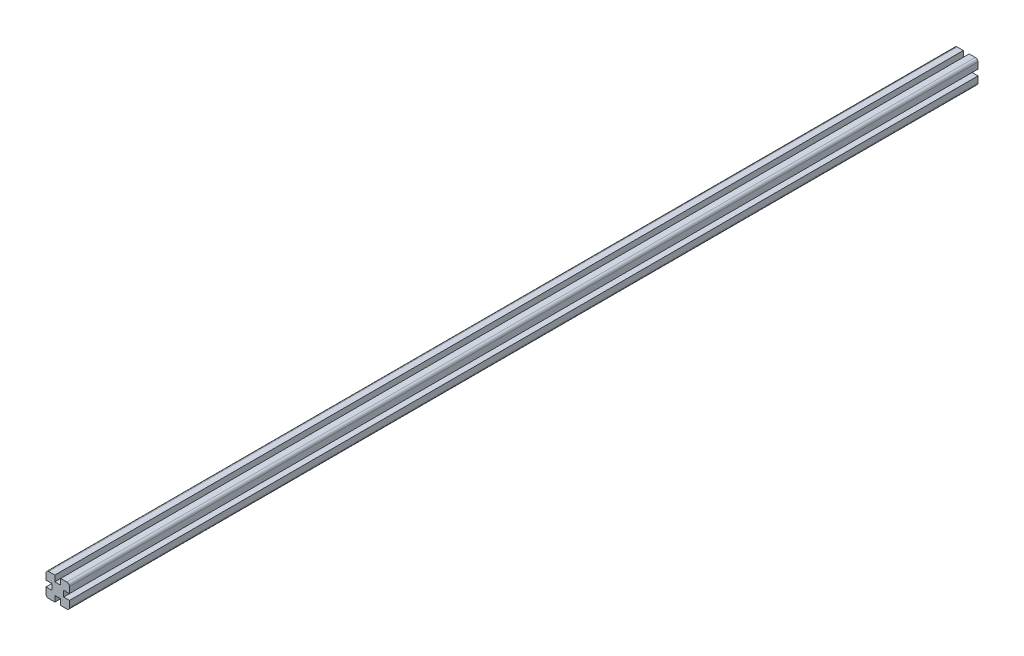
ISO-10303-21;
HEADER;
FILE_DESCRIPTION(('STEP AP214'),'2;1');
FILE_NAME('part.step','',(''),(''),'','','');
FILE_SCHEMA(('AUTOMOTIVE_DESIGN { 1 0 10303 214 1 1 1 1 }'));
ENDSEC;
DATA;
#1=APPLICATION_CONTEXT('core data for automotive mechanical design processes');
#2=APPLICATION_PROTOCOL_DEFINITION('international standard','automotive_design',2000,#1);
#3=PRODUCT_CONTEXT('',#1,'mechanical');
#4=PRODUCT('Part','Part','',(#3));
#5=PRODUCT_RELATED_PRODUCT_CATEGORY('part','',(#4));
#6=PRODUCT_DEFINITION_FORMATION('','',#4);
#7=PRODUCT_DEFINITION_CONTEXT('part definition',#1,'design');
#8=PRODUCT_DEFINITION('design','',#6,#7);
#9=PRODUCT_DEFINITION_SHAPE('','',#8);
#10=(LENGTH_UNIT() NAMED_UNIT(*) SI_UNIT(.MILLI.,.METRE.));
#11=(NAMED_UNIT(*) PLANE_ANGLE_UNIT() SI_UNIT($,.RADIAN.));
#12=(NAMED_UNIT(*) SI_UNIT($,.STERADIAN.) SOLID_ANGLE_UNIT());
#13=UNCERTAINTY_MEASURE_WITH_UNIT(LENGTH_MEASURE(1.E-05),#10,'distance_accuracy_value','');
#14=(GEOMETRIC_REPRESENTATION_CONTEXT(3) GLOBAL_UNCERTAINTY_ASSIGNED_CONTEXT((#13)) GLOBAL_UNIT_ASSIGNED_CONTEXT((#10,
#11,#12)) REPRESENTATION_CONTEXT('',''));
#15=CARTESIAN_POINT('',(0.,0.,0.));
#16=DIRECTION('',(0.,0.,1.));
#17=DIRECTION('',(1.,0.,0.));
#18=AXIS2_PLACEMENT_3D('',#15,#16,#17);
#19=CARTESIAN_POINT('',(-5.,-20.,1550.));
#20=DIRECTION('',(-1.,0.,0.));
#21=DIRECTION('',(0.,-1.,0.));
#22=AXIS2_PLACEMENT_3D('',#19,#20,#21);
#23=PLANE('',#22);
#24=DIRECTION('',(0.,1.,0.));
#25=VECTOR('',#24,1.);
#26=CARTESIAN_POINT('',(-5.,-20.,0.));
#27=LINE('',#26,#25);
#28=CARTESIAN_POINT('',(-5.,-20.,0.));
#29=VERTEX_POINT('',#28);
#30=CARTESIAN_POINT('',(-5.,-10.,0.));
#31=VERTEX_POINT('',#30);
#32=EDGE_CURVE('E231',#29,#31,#27,.T.);
#33=ORIENTED_EDGE('',*,*,#32,.T.);
#34=DIRECTION('',(0.,0.,-1.));
#35=VECTOR('',#34,1.);
#36=CARTESIAN_POINT('',(-5.,-10.,1550.));
#37=LINE('',#36,#35);
#38=CARTESIAN_POINT('',(-5.,-10.,1550.));
#39=VERTEX_POINT('',#38);
#40=EDGE_CURVE('E11',#39,#31,#37,.T.);
#41=ORIENTED_EDGE('',*,*,#40,.F.);
#42=DIRECTION('',(0.,1.,0.));
#43=VECTOR('',#42,1.);
#44=CARTESIAN_POINT('',(-5.,-20.,1550.));
#45=LINE('',#44,#43);
#46=CARTESIAN_POINT('',(-5.,-20.,1550.));
#47=VERTEX_POINT('',#46);
#48=EDGE_CURVE('E278',#47,#39,#45,.T.);
#49=ORIENTED_EDGE('',*,*,#48,.F.);
#50=DIRECTION('',(0.,0.,-1.));
#51=VECTOR('',#50,1.);
#52=CARTESIAN_POINT('',(-5.,-20.,1550.));
#53=LINE('',#52,#51);
#54=EDGE_CURVE('E227',#47,#29,#53,.T.);
#55=ORIENTED_EDGE('',*,*,#54,.T.);
#56=EDGE_LOOP('',(#33,#41,#49,#55));
#57=FACE_BOUND('',#56,.T.);
#58=ADVANCED_FACE('F39',(#57),#23,.F.);
#59=CARTESIAN_POINT('',(-5.,-10.,1550.));
#60=DIRECTION('',(0.,1.,0.));
#61=DIRECTION('',(-1.,0.,0.));
#62=AXIS2_PLACEMENT_3D('',#59,#60,#61);
#63=PLANE('',#62);
#64=DIRECTION('',(1.,0.,0.));
#65=VECTOR('',#64,1.);
#66=CARTESIAN_POINT('',(-5.,-10.,0.));
#67=LINE('',#66,#65);
#68=CARTESIAN_POINT('',(5.,-10.,0.));
#69=VERTEX_POINT('',#68);
#70=EDGE_CURVE('E234',#31,#69,#67,.T.);
#71=ORIENTED_EDGE('',*,*,#70,.T.);
#72=DIRECTION('',(0.,0.,-1.));
#73=VECTOR('',#72,1.);
#74=CARTESIAN_POINT('',(5.,-10.,1550.));
#75=LINE('',#74,#73);
#76=CARTESIAN_POINT('',(5.,-10.,1550.));
#77=VERTEX_POINT('',#76);
#78=EDGE_CURVE('E47',#77,#69,#75,.T.);
#79=ORIENTED_EDGE('',*,*,#78,.F.);
#80=DIRECTION('',(1.,0.,0.));
#81=VECTOR('',#80,1.);
#82=CARTESIAN_POINT('',(-5.,-10.,1550.));
#83=LINE('',#82,#81);
#84=EDGE_CURVE('E146',#39,#77,#83,.T.);
#85=ORIENTED_EDGE('',*,*,#84,.F.);
#86=ORIENTED_EDGE('',*,*,#40,.T.);
#87=EDGE_LOOP('',(#71,#79,#85,#86));
#88=FACE_BOUND('',#87,.T.);
#89=ADVANCED_FACE('F416',(#88),#63,.F.);
#90=CARTESIAN_POINT('',(5.,-20.,1550.));
#91=DIRECTION('',(1.,0.,0.));
#92=DIRECTION('',(0.,0.,-1.));
#93=AXIS2_PLACEMENT_3D('',#90,#91,#92);
#94=PLANE('',#93);
#95=DIRECTION('',(0.,-1.,0.));
#96=VECTOR('',#95,1.);
#97=CARTESIAN_POINT('',(5.,-20.,0.));
#98=LINE('',#97,#96);
#99=CARTESIAN_POINT('',(5.,-20.,0.));
#100=VERTEX_POINT('',#99);
#101=EDGE_CURVE('E236',#69,#100,#98,.T.);
#102=ORIENTED_EDGE('',*,*,#101,.T.);
#103=DIRECTION('',(0.,0.,-1.));
#104=VECTOR('',#103,1.);
#105=CARTESIAN_POINT('',(5.,-20.,1550.));
#106=LINE('',#105,#104);
#107=CARTESIAN_POINT('',(5.,-20.,1550.));
#108=VERTEX_POINT('',#107);
#109=EDGE_CURVE('E333',#108,#100,#106,.T.);
#110=ORIENTED_EDGE('',*,*,#109,.F.);
#111=DIRECTION('',(0.,-1.,0.));
#112=VECTOR('',#111,1.);
#113=CARTESIAN_POINT('',(5.,-20.,1550.));
#114=LINE('',#113,#112);
#115=EDGE_CURVE('E341',#77,#108,#114,.T.);
#116=ORIENTED_EDGE('',*,*,#115,.F.);
#117=ORIENTED_EDGE('',*,*,#78,.T.);
#118=EDGE_LOOP('',(#102,#110,#116,#117));
#119=FACE_BOUND('',#118,.T.);
#120=ADVANCED_FACE('F339',(#119),#94,.F.);
#121=CARTESIAN_POINT('',(5.,-20.,1550.));
#122=DIRECTION('',(0.,1.,0.));
#123=DIRECTION('',(0.,0.,1.));
#124=AXIS2_PLACEMENT_3D('',#121,#122,#123);
#125=PLANE('',#124);
#126=DIRECTION('',(1.,0.,0.));
#127=VECTOR('',#126,1.);
#128=CARTESIAN_POINT('',(5.,-20.,0.));
#129=LINE('',#128,#127);
#130=CARTESIAN_POINT('',(15.5,-20.,0.));
#131=VERTEX_POINT('',#130);
#132=EDGE_CURVE('E238',#100,#131,#129,.T.);
#133=ORIENTED_EDGE('',*,*,#132,.T.);
#134=DIRECTION('',(0.,0.,-1.));
#135=VECTOR('',#134,1.);
#136=CARTESIAN_POINT('',(15.5,-20.,1550.));
#137=LINE('',#136,#135);
#138=CARTESIAN_POINT('',(15.5,-20.,1550.));
#139=VERTEX_POINT('',#138);
#140=EDGE_CURVE('E330',#139,#131,#137,.T.);
#141=ORIENTED_EDGE('',*,*,#140,.F.);
#142=DIRECTION('',(1.,0.,0.));
#143=VECTOR('',#142,1.);
#144=CARTESIAN_POINT('',(5.,-20.,1550.));
#145=LINE('',#144,#143);
#146=EDGE_CURVE('E359',#108,#139,#145,.T.);
#147=ORIENTED_EDGE('',*,*,#146,.F.);
#148=ORIENTED_EDGE('',*,*,#109,.T.);
#149=EDGE_LOOP('',(#133,#141,#147,#148));
#150=FACE_BOUND('',#149,.T.);
#151=ADVANCED_FACE('F350',(#150),#125,.F.);
#152=CARTESIAN_POINT('',(15.5,-15.5,1550.));
#153=DIRECTION('',(0.,0.,-1.));
#154=DIRECTION('',(-1.,0.,0.));
#155=AXIS2_PLACEMENT_3D('',#152,#153,#154);
#156=CYLINDRICAL_SURFACE('',#155,4.5);
#157=CARTESIAN_POINT('',(15.5,-15.5,0.));
#158=DIRECTION('',(0.,0.,1.));
#159=DIRECTION('',(1.,0.,0.));
#160=AXIS2_PLACEMENT_3D('',#157,#158,#159);
#161=CIRCLE('',#160,4.5);
#162=CARTESIAN_POINT('',(20.,-15.5,0.));
#163=VERTEX_POINT('',#162);
#164=EDGE_CURVE('E240',#131,#163,#161,.T.);
#165=ORIENTED_EDGE('',*,*,#164,.T.);
#166=DIRECTION('',(0.,0.,-1.));
#167=VECTOR('',#166,1.);
#168=CARTESIAN_POINT('',(20.,-15.5,1550.));
#169=LINE('',#168,#167);
#170=CARTESIAN_POINT('',(20.,-15.5,1550.));
#171=VERTEX_POINT('',#170);
#172=EDGE_CURVE('E327',#171,#163,#169,.T.);
#173=ORIENTED_EDGE('',*,*,#172,.F.);
#174=CARTESIAN_POINT('',(15.5,-15.5,1550.));
#175=DIRECTION('',(0.,0.,1.));
#176=DIRECTION('',(1.,0.,0.));
#177=AXIS2_PLACEMENT_3D('',#174,#175,#176);
#178=CIRCLE('',#177,4.5);
#179=EDGE_CURVE('E356',#139,#171,#178,.T.);
#180=ORIENTED_EDGE('',*,*,#179,.F.);
#181=ORIENTED_EDGE('',*,*,#140,.T.);
#182=EDGE_LOOP('',(#165,#173,#180,#181));
#183=FACE_BOUND('',#182,.T.);
#184=ADVANCED_FACE('F354',(#183),#156,.T.);
#185=CARTESIAN_POINT('',(20.,-15.5,1550.));
#186=DIRECTION('',(-1.,0.,0.));
#187=DIRECTION('',(0.,0.,1.));
#188=AXIS2_PLACEMENT_3D('',#185,#186,#187);
#189=PLANE('',#188);
#190=DIRECTION('',(0.,1.,0.));
#191=VECTOR('',#190,1.);
#192=CARTESIAN_POINT('',(20.,-15.5,0.));
#193=LINE('',#192,#191);
#194=CARTESIAN_POINT('',(20.,-4.99999999999999,0.));
#195=VERTEX_POINT('',#194);
#196=EDGE_CURVE('E242',#163,#195,#193,.T.);
#197=ORIENTED_EDGE('',*,*,#196,.T.);
#198=DIRECTION('',(0.,0.,-1.));
#199=VECTOR('',#198,1.);
#200=CARTESIAN_POINT('',(20.,-4.99999999999999,1550.));
#201=LINE('',#200,#199);
#202=CARTESIAN_POINT('',(20.,-4.99999999999999,1550.));
#203=VERTEX_POINT('',#202);
#204=EDGE_CURVE('E324',#203,#195,#201,.T.);
#205=ORIENTED_EDGE('',*,*,#204,.F.);
#206=DIRECTION('',(0.,1.,0.));
#207=VECTOR('',#206,1.);
#208=CARTESIAN_POINT('',(20.,-15.5,1550.));
#209=LINE('',#208,#207);
#210=EDGE_CURVE('E358',#171,#203,#209,.T.);
#211=ORIENTED_EDGE('',*,*,#210,.F.);
#212=ORIENTED_EDGE('',*,*,#172,.T.);
#213=EDGE_LOOP('',(#197,#205,#211,#212));
#214=FACE_BOUND('',#213,.T.);
#215=ADVANCED_FACE('F429',(#214),#189,.F.);
#216=CARTESIAN_POINT('',(20.,-4.99999999999999,1550.));
#217=DIRECTION('',(0.,-1.,0.));
#218=DIRECTION('',(1.,0.,0.));
#219=AXIS2_PLACEMENT_3D('',#216,#217,#218);
#220=PLANE('',#219);
#221=DIRECTION('',(-1.,0.,0.));
#222=VECTOR('',#221,1.);
#223=CARTESIAN_POINT('',(20.,-4.99999999999999,0.));
#224=LINE('',#223,#222);
#225=CARTESIAN_POINT('',(10.,-5.,0.));
#226=VERTEX_POINT('',#225);
#227=EDGE_CURVE('E244',#195,#226,#224,.T.);
#228=ORIENTED_EDGE('',*,*,#227,.T.);
#229=DIRECTION('',(0.,0.,-1.));
#230=VECTOR('',#229,1.);
#231=CARTESIAN_POINT('',(10.,-5.,1550.));
#232=LINE('',#231,#230);
#233=CARTESIAN_POINT('',(10.,-5.,1550.));
#234=VERTEX_POINT('',#233);
#235=EDGE_CURVE('E321',#234,#226,#232,.T.);
#236=ORIENTED_EDGE('',*,*,#235,.F.);
#237=DIRECTION('',(-1.,0.,0.));
#238=VECTOR('',#237,1.);
#239=CARTESIAN_POINT('',(20.,-4.99999999999999,1550.));
#240=LINE('',#239,#238);
#241=EDGE_CURVE('E361',#203,#234,#240,.T.);
#242=ORIENTED_EDGE('',*,*,#241,.F.);
#243=ORIENTED_EDGE('',*,*,#204,.T.);
#244=EDGE_LOOP('',(#228,#236,#242,#243));
#245=FACE_BOUND('',#244,.T.);
#246=ADVANCED_FACE('F432',(#245),#220,.F.);
#247=CARTESIAN_POINT('',(10.,-5.,1550.));
#248=DIRECTION('',(-1.,0.,0.));
#249=DIRECTION('',(0.,-1.,0.));
#250=AXIS2_PLACEMENT_3D('',#247,#248,#249);
#251=PLANE('',#250);
#252=DIRECTION('',(0.,1.,0.));
#253=VECTOR('',#252,1.);
#254=CARTESIAN_POINT('',(10.,-5.,0.));
#255=LINE('',#254,#253);
#256=CARTESIAN_POINT('',(10.,5.,0.));
#257=VERTEX_POINT('',#256);
#258=EDGE_CURVE('E246',#226,#257,#255,.T.);
#259=ORIENTED_EDGE('',*,*,#258,.T.);
#260=DIRECTION('',(0.,0.,-1.));
#261=VECTOR('',#260,1.);
#262=CARTESIAN_POINT('',(10.,5.,1550.));
#263=LINE('',#262,#261);
#264=CARTESIAN_POINT('',(10.,5.,1550.));
#265=VERTEX_POINT('',#264);
#266=EDGE_CURVE('E318',#265,#257,#263,.T.);
#267=ORIENTED_EDGE('',*,*,#266,.F.);
#268=DIRECTION('',(0.,1.,0.));
#269=VECTOR('',#268,1.);
#270=CARTESIAN_POINT('',(10.,-5.,1550.));
#271=LINE('',#270,#269);
#272=EDGE_CURVE('E367',#234,#265,#271,.T.);
#273=ORIENTED_EDGE('',*,*,#272,.F.);
#274=ORIENTED_EDGE('',*,*,#235,.T.);
#275=EDGE_LOOP('',(#259,#267,#273,#274));
#276=FACE_BOUND('',#275,.T.);
#277=ADVANCED_FACE('F436',(#276),#251,.F.);
#278=CARTESIAN_POINT('',(20.,5.,1550.));
#279=DIRECTION('',(0.,1.,0.));
#280=DIRECTION('',(-1.,0.,0.));
#281=AXIS2_PLACEMENT_3D('',#278,#279,#280);
#282=PLANE('',#281);
#283=DIRECTION('',(1.,0.,0.));
#284=VECTOR('',#283,1.);
#285=CARTESIAN_POINT('',(20.,5.,0.));
#286=LINE('',#285,#284);
#287=CARTESIAN_POINT('',(20.,5.,0.));
#288=VERTEX_POINT('',#287);
#289=EDGE_CURVE('E248',#257,#288,#286,.T.);
#290=ORIENTED_EDGE('',*,*,#289,.T.);
#291=DIRECTION('',(0.,0.,-1.));
#292=VECTOR('',#291,1.);
#293=CARTESIAN_POINT('',(20.,5.,1550.));
#294=LINE('',#293,#292);
#295=CARTESIAN_POINT('',(20.,5.,1550.));
#296=VERTEX_POINT('',#295);
#297=EDGE_CURVE('E315',#296,#288,#294,.T.);
#298=ORIENTED_EDGE('',*,*,#297,.F.);
#299=DIRECTION('',(1.,0.,0.));
#300=VECTOR('',#299,1.);
#301=CARTESIAN_POINT('',(20.,5.,1550.));
#302=LINE('',#301,#300);
#303=EDGE_CURVE('E369',#265,#296,#302,.T.);
#304=ORIENTED_EDGE('',*,*,#303,.F.);
#305=ORIENTED_EDGE('',*,*,#266,.T.);
#306=EDGE_LOOP('',(#290,#298,#304,#305));
#307=FACE_BOUND('',#306,.T.);
#308=ADVANCED_FACE('F440',(#307),#282,.F.);
#309=CARTESIAN_POINT('',(20.,5.,1550.));
#310=DIRECTION('',(-1.,0.,0.));
#311=DIRECTION('',(0.,0.,1.));
#312=AXIS2_PLACEMENT_3D('',#309,#310,#311);
#313=PLANE('',#312);
#314=DIRECTION('',(0.,1.,0.));
#315=VECTOR('',#314,1.);
#316=CARTESIAN_POINT('',(20.,5.,0.));
#317=LINE('',#316,#315);
#318=CARTESIAN_POINT('',(20.,15.5,0.));
#319=VERTEX_POINT('',#318);
#320=EDGE_CURVE('E250',#288,#319,#317,.T.);
#321=ORIENTED_EDGE('',*,*,#320,.T.);
#322=DIRECTION('',(0.,0.,-1.));
#323=VECTOR('',#322,1.);
#324=CARTESIAN_POINT('',(20.,15.5,1550.));
#325=LINE('',#324,#323);
#326=CARTESIAN_POINT('',(20.,15.5,1550.));
#327=VERTEX_POINT('',#326);
#328=EDGE_CURVE('E312',#327,#319,#325,.T.);
#329=ORIENTED_EDGE('',*,*,#328,.F.);
#330=DIRECTION('',(0.,1.,0.));
#331=VECTOR('',#330,1.);
#332=CARTESIAN_POINT('',(20.,5.,1550.));
#333=LINE('',#332,#331);
#334=EDGE_CURVE('E371',#296,#327,#333,.T.);
#335=ORIENTED_EDGE('',*,*,#334,.F.);
#336=ORIENTED_EDGE('',*,*,#297,.T.);
#337=EDGE_LOOP('',(#321,#329,#335,#336));
#338=FACE_BOUND('',#337,.T.);
#339=ADVANCED_FACE('F444',(#338),#313,.F.);
#340=CARTESIAN_POINT('',(15.5,15.5,1550.));
#341=DIRECTION('',(0.,0.,-1.));
#342=DIRECTION('',(-1.,0.,0.));
#343=AXIS2_PLACEMENT_3D('',#340,#341,#342);
#344=CYLINDRICAL_SURFACE('',#343,4.5);
#345=CARTESIAN_POINT('',(15.5,15.5,0.));
#346=DIRECTION('',(0.,0.,1.));
#347=DIRECTION('',(-1.,0.,0.));
#348=AXIS2_PLACEMENT_3D('',#345,#346,#347);
#349=CIRCLE('',#348,4.5);
#350=CARTESIAN_POINT('',(15.5,20.,0.));
#351=VERTEX_POINT('',#350);
#352=EDGE_CURVE('E252',#319,#351,#349,.T.);
#353=ORIENTED_EDGE('',*,*,#352,.T.);
#354=DIRECTION('',(0.,0.,-1.));
#355=VECTOR('',#354,1.);
#356=CARTESIAN_POINT('',(15.5,20.,1550.));
#357=LINE('',#356,#355);
#358=CARTESIAN_POINT('',(15.5,20.,1550.));
#359=VERTEX_POINT('',#358);
#360=EDGE_CURVE('E309',#359,#351,#357,.T.);
#361=ORIENTED_EDGE('',*,*,#360,.F.);
#362=CARTESIAN_POINT('',(15.5,15.5,1550.));
#363=DIRECTION('',(0.,0.,1.));
#364=DIRECTION('',(-1.,0.,0.));
#365=AXIS2_PLACEMENT_3D('',#362,#363,#364);
#366=CIRCLE('',#365,4.5);
#367=EDGE_CURVE('E373',#327,#359,#366,.T.);
#368=ORIENTED_EDGE('',*,*,#367,.F.);
#369=ORIENTED_EDGE('',*,*,#328,.T.);
#370=EDGE_LOOP('',(#353,#361,#368,#369));
#371=FACE_BOUND('',#370,.T.);
#372=ADVANCED_FACE('F448',(#371),#344,.T.);
#373=CARTESIAN_POINT('',(4.99999999999999,20.,1550.));
#374=DIRECTION('',(0.,-1.,0.));
#375=DIRECTION('',(0.,0.,-1.));
#376=AXIS2_PLACEMENT_3D('',#373,#374,#375);
#377=PLANE('',#376);
#378=DIRECTION('',(-1.,0.,0.));
#379=VECTOR('',#378,1.);
#380=CARTESIAN_POINT('',(4.99999999999999,20.,0.));
#381=LINE('',#380,#379);
#382=CARTESIAN_POINT('',(4.99999999999999,20.,0.));
#383=VERTEX_POINT('',#382);
#384=EDGE_CURVE('E254',#351,#383,#381,.T.);
#385=ORIENTED_EDGE('',*,*,#384,.T.);
#386=DIRECTION('',(0.,0.,-1.));
#387=VECTOR('',#386,1.);
#388=CARTESIAN_POINT('',(4.99999999999999,20.,1550.));
#389=LINE('',#388,#387);
#390=CARTESIAN_POINT('',(4.99999999999999,20.,1550.));
#391=VERTEX_POINT('',#390);
#392=EDGE_CURVE('E306',#391,#383,#389,.T.);
#393=ORIENTED_EDGE('',*,*,#392,.F.);
#394=DIRECTION('',(-1.,0.,0.));
#395=VECTOR('',#394,1.);
#396=CARTESIAN_POINT('',(4.99999999999999,20.,1550.));
#397=LINE('',#396,#395);
#398=EDGE_CURVE('E375',#359,#391,#397,.T.);
#399=ORIENTED_EDGE('',*,*,#398,.F.);
#400=ORIENTED_EDGE('',*,*,#360,.T.);
#401=EDGE_LOOP('',(#385,#393,#399,#400));
#402=FACE_BOUND('',#401,.T.);
#403=ADVANCED_FACE('F452',(#402),#377,.F.);
#404=CARTESIAN_POINT('',(4.99999999999999,20.,1550.));
#405=DIRECTION('',(1.,0.,0.));
#406=DIRECTION('',(0.,1.,0.));
#407=AXIS2_PLACEMENT_3D('',#404,#405,#406);
#408=PLANE('',#407);
#409=DIRECTION('',(0.,-1.,0.));
#410=VECTOR('',#409,1.);
#411=CARTESIAN_POINT('',(4.99999999999999,20.,0.));
#412=LINE('',#411,#410);
#413=CARTESIAN_POINT('',(5.,10.,0.));
#414=VERTEX_POINT('',#413);
#415=EDGE_CURVE('E256',#383,#414,#412,.T.);
#416=ORIENTED_EDGE('',*,*,#415,.T.);
#417=DIRECTION('',(0.,0.,-1.));
#418=VECTOR('',#417,1.);
#419=CARTESIAN_POINT('',(5.,10.,1550.));
#420=LINE('',#419,#418);
#421=CARTESIAN_POINT('',(5.,10.,1550.));
#422=VERTEX_POINT('',#421);
#423=EDGE_CURVE('E303',#422,#414,#420,.T.);
#424=ORIENTED_EDGE('',*,*,#423,.F.);
#425=DIRECTION('',(0.,-1.,0.));
#426=VECTOR('',#425,1.);
#427=CARTESIAN_POINT('',(4.99999999999999,20.,1550.));
#428=LINE('',#427,#426);
#429=EDGE_CURVE('E377',#391,#422,#428,.T.);
#430=ORIENTED_EDGE('',*,*,#429,.F.);
#431=ORIENTED_EDGE('',*,*,#392,.T.);
#432=EDGE_LOOP('',(#416,#424,#430,#431));
#433=FACE_BOUND('',#432,.T.);
#434=ADVANCED_FACE('F456',(#433),#408,.F.);
#435=CARTESIAN_POINT('',(5.,10.,1550.));
#436=DIRECTION('',(0.,-1.,0.));
#437=DIRECTION('',(1.,0.,0.));
#438=AXIS2_PLACEMENT_3D('',#435,#436,#437);
#439=PLANE('',#438);
#440=DIRECTION('',(-1.,0.,0.));
#441=VECTOR('',#440,1.);
#442=CARTESIAN_POINT('',(5.,10.,0.));
#443=LINE('',#442,#441);
#444=CARTESIAN_POINT('',(-5.,10.,0.));
#445=VERTEX_POINT('',#444);
#446=EDGE_CURVE('E258',#414,#445,#443,.T.);
#447=ORIENTED_EDGE('',*,*,#446,.T.);
#448=DIRECTION('',(0.,0.,-1.));
#449=VECTOR('',#448,1.);
#450=CARTESIAN_POINT('',(-5.,10.,1550.));
#451=LINE('',#450,#449);
#452=CARTESIAN_POINT('',(-5.,10.,1550.));
#453=VERTEX_POINT('',#452);
#454=EDGE_CURVE('E300',#453,#445,#451,.T.);
#455=ORIENTED_EDGE('',*,*,#454,.F.);
#456=DIRECTION('',(-1.,0.,0.));
#457=VECTOR('',#456,1.);
#458=CARTESIAN_POINT('',(5.,10.,1550.));
#459=LINE('',#458,#457);
#460=EDGE_CURVE('E379',#422,#453,#459,.T.);
#461=ORIENTED_EDGE('',*,*,#460,.F.);
#462=ORIENTED_EDGE('',*,*,#423,.T.);
#463=EDGE_LOOP('',(#447,#455,#461,#462));
#464=FACE_BOUND('',#463,.T.);
#465=ADVANCED_FACE('F460',(#464),#439,.F.);
#466=CARTESIAN_POINT('',(-5.,20.,1550.));
#467=DIRECTION('',(-1.,0.,0.));
#468=DIRECTION('',(0.,-1.,0.));
#469=AXIS2_PLACEMENT_3D('',#466,#467,#468);
#470=PLANE('',#469);
#471=DIRECTION('',(0.,1.,0.));
#472=VECTOR('',#471,1.);
#473=CARTESIAN_POINT('',(-5.,20.,0.));
#474=LINE('',#473,#472);
#475=CARTESIAN_POINT('',(-5.,20.,0.));
#476=VERTEX_POINT('',#475);
#477=EDGE_CURVE('E260',#445,#476,#474,.T.);
#478=ORIENTED_EDGE('',*,*,#477,.T.);
#479=DIRECTION('',(0.,0.,-1.));
#480=VECTOR('',#479,1.);
#481=CARTESIAN_POINT('',(-5.,20.,1550.));
#482=LINE('',#481,#480);
#483=CARTESIAN_POINT('',(-5.,20.,1550.));
#484=VERTEX_POINT('',#483);
#485=EDGE_CURVE('E297',#484,#476,#482,.T.);
#486=ORIENTED_EDGE('',*,*,#485,.F.);
#487=DIRECTION('',(0.,1.,0.));
#488=VECTOR('',#487,1.);
#489=CARTESIAN_POINT('',(-5.,20.,1550.));
#490=LINE('',#489,#488);
#491=EDGE_CURVE('E381',#453,#484,#490,.T.);
#492=ORIENTED_EDGE('',*,*,#491,.F.);
#493=ORIENTED_EDGE('',*,*,#454,.T.);
#494=EDGE_LOOP('',(#478,#486,#492,#493));
#495=FACE_BOUND('',#494,.T.);
#496=ADVANCED_FACE('F464',(#495),#470,.F.);
#497=CARTESIAN_POINT('',(-15.5,20.,1550.));
#498=DIRECTION('',(0.,-1.,0.));
#499=DIRECTION('',(0.,0.,-1.));
#500=AXIS2_PLACEMENT_3D('',#497,#498,#499);
#501=PLANE('',#500);
#502=DIRECTION('',(-1.,0.,0.));
#503=VECTOR('',#502,1.);
#504=CARTESIAN_POINT('',(-15.5,20.,0.));
#505=LINE('',#504,#503);
#506=CARTESIAN_POINT('',(-15.5,20.,0.));
#507=VERTEX_POINT('',#506);
#508=EDGE_CURVE('E263',#476,#507,#505,.T.);
#509=ORIENTED_EDGE('',*,*,#508,.T.);
#510=DIRECTION('',(0.,0.,-1.));
#511=VECTOR('',#510,1.);
#512=CARTESIAN_POINT('',(-15.5,20.,1550.));
#513=LINE('',#512,#511);
#514=CARTESIAN_POINT('',(-15.5,20.,1550.));
#515=VERTEX_POINT('',#514);
#516=EDGE_CURVE('E294',#515,#507,#513,.T.);
#517=ORIENTED_EDGE('',*,*,#516,.F.);
#518=DIRECTION('',(-1.,0.,0.));
#519=VECTOR('',#518,1.);
#520=CARTESIAN_POINT('',(-8.,20.,1550.));
#521=LINE('',#520,#519);
#522=EDGE_CURVE('E383',#484,#515,#521,.T.);
#523=ORIENTED_EDGE('',*,*,#522,.F.);
#524=ORIENTED_EDGE('',*,*,#485,.T.);
#525=EDGE_LOOP('',(#509,#517,#523,#524));
#526=FACE_BOUND('',#525,.T.);
#527=ADVANCED_FACE('F468',(#526),#501,.F.);
#528=CARTESIAN_POINT('',(-15.5,15.5,1550.));
#529=DIRECTION('',(0.,0.,-1.));
#530=DIRECTION('',(-1.,0.,0.));
#531=AXIS2_PLACEMENT_3D('',#528,#529,#530);
#532=CYLINDRICAL_SURFACE('',#531,4.5);
#533=CARTESIAN_POINT('',(-15.5,15.5,0.));
#534=DIRECTION('',(0.,0.,1.));
#535=DIRECTION('',(-1.,0.,0.));
#536=AXIS2_PLACEMENT_3D('',#533,#534,#535);
#537=CIRCLE('',#536,4.5);
#538=CARTESIAN_POINT('',(-20.,15.5,0.));
#539=VERTEX_POINT('',#538);
#540=EDGE_CURVE('E265',#507,#539,#537,.T.);
#541=ORIENTED_EDGE('',*,*,#540,.T.);
#542=DIRECTION('',(0.,0.,-1.));
#543=VECTOR('',#542,1.);
#544=CARTESIAN_POINT('',(-20.,15.5,1550.));
#545=LINE('',#544,#543);
#546=CARTESIAN_POINT('',(-20.,15.5,1550.));
#547=VERTEX_POINT('',#546);
#548=EDGE_CURVE('E291',#547,#539,#545,.T.);
#549=ORIENTED_EDGE('',*,*,#548,.F.);
#550=CARTESIAN_POINT('',(-15.5,15.5,1550.));
#551=DIRECTION('',(0.,0.,1.));
#552=DIRECTION('',(-1.,0.,0.));
#553=AXIS2_PLACEMENT_3D('',#550,#551,#552);
#554=CIRCLE('',#553,4.5);
#555=EDGE_CURVE('E385',#515,#547,#554,.T.);
#556=ORIENTED_EDGE('',*,*,#555,.F.);
#557=ORIENTED_EDGE('',*,*,#516,.T.);
#558=EDGE_LOOP('',(#541,#549,#556,#557));
#559=FACE_BOUND('',#558,.T.);
#560=ADVANCED_FACE('F472',(#559),#532,.T.);
#561=CARTESIAN_POINT('',(-20.,4.99999999999999,1550.));
#562=DIRECTION('',(1.,0.,0.));
#563=DIRECTION('',(0.,0.,-1.));
#564=AXIS2_PLACEMENT_3D('',#561,#562,#563);
#565=PLANE('',#564);
#566=DIRECTION('',(0.,-1.,0.));
#567=VECTOR('',#566,1.);
#568=CARTESIAN_POINT('',(-20.,4.99999999999999,0.));
#569=LINE('',#568,#567);
#570=CARTESIAN_POINT('',(-20.,4.99999999999999,0.));
#571=VERTEX_POINT('',#570);
#572=EDGE_CURVE('E267',#539,#571,#569,.T.);
#573=ORIENTED_EDGE('',*,*,#572,.T.);
#574=DIRECTION('',(0.,0.,-1.));
#575=VECTOR('',#574,1.);
#576=CARTESIAN_POINT('',(-20.,4.99999999999999,1550.));
#577=LINE('',#576,#575);
#578=CARTESIAN_POINT('',(-20.,4.99999999999999,1550.));
#579=VERTEX_POINT('',#578);
#580=EDGE_CURVE('E288',#579,#571,#577,.T.);
#581=ORIENTED_EDGE('',*,*,#580,.F.);
#582=DIRECTION('',(0.,-1.,0.));
#583=VECTOR('',#582,1.);
#584=CARTESIAN_POINT('',(-20.,4.99999999999999,1550.));
#585=LINE('',#584,#583);
#586=EDGE_CURVE('E387',#547,#579,#585,.T.);
#587=ORIENTED_EDGE('',*,*,#586,.F.);
#588=ORIENTED_EDGE('',*,*,#548,.T.);
#589=EDGE_LOOP('',(#573,#581,#587,#588));
#590=FACE_BOUND('',#589,.T.);
#591=ADVANCED_FACE('F476',(#590),#565,.F.);
#592=CARTESIAN_POINT('',(-20.,4.99999999999999,1550.));
#593=DIRECTION('',(0.,1.,0.));
#594=DIRECTION('',(-1.,0.,0.));
#595=AXIS2_PLACEMENT_3D('',#592,#593,#594);
#596=PLANE('',#595);
#597=DIRECTION('',(1.,0.,0.));
#598=VECTOR('',#597,1.);
#599=CARTESIAN_POINT('',(-20.,4.99999999999999,0.));
#600=LINE('',#599,#598);
#601=CARTESIAN_POINT('',(-10.,5.,0.));
#602=VERTEX_POINT('',#601);
#603=EDGE_CURVE('E269',#571,#602,#600,.T.);
#604=ORIENTED_EDGE('',*,*,#603,.T.);
#605=DIRECTION('',(0.,0.,-1.));
#606=VECTOR('',#605,1.);
#607=CARTESIAN_POINT('',(-10.,5.,1550.));
#608=LINE('',#607,#606);
#609=CARTESIAN_POINT('',(-10.,5.,1550.));
#610=VERTEX_POINT('',#609);
#611=EDGE_CURVE('E285',#610,#602,#608,.T.);
#612=ORIENTED_EDGE('',*,*,#611,.F.);
#613=DIRECTION('',(1.,0.,0.));
#614=VECTOR('',#613,1.);
#615=CARTESIAN_POINT('',(-20.,4.99999999999999,1550.));
#616=LINE('',#615,#614);
#617=EDGE_CURVE('E389',#579,#610,#616,.T.);
#618=ORIENTED_EDGE('',*,*,#617,.F.);
#619=ORIENTED_EDGE('',*,*,#580,.T.);
#620=EDGE_LOOP('',(#604,#612,#618,#619));
#621=FACE_BOUND('',#620,.T.);
#622=ADVANCED_FACE('F480',(#621),#596,.F.);
#623=CARTESIAN_POINT('',(-10.,5.,1550.));
#624=DIRECTION('',(1.,0.,0.));
#625=DIRECTION('',(0.,1.,0.));
#626=AXIS2_PLACEMENT_3D('',#623,#624,#625);
#627=PLANE('',#626);
#628=DIRECTION('',(0.,-1.,0.));
#629=VECTOR('',#628,1.);
#630=CARTESIAN_POINT('',(-10.,5.,0.));
#631=LINE('',#630,#629);
#632=CARTESIAN_POINT('',(-10.,-5.,0.));
#633=VERTEX_POINT('',#632);
#634=EDGE_CURVE('E271',#602,#633,#631,.T.);
#635=ORIENTED_EDGE('',*,*,#634,.T.);
#636=DIRECTION('',(0.,0.,-1.));
#637=VECTOR('',#636,1.);
#638=CARTESIAN_POINT('',(-10.,-5.,1550.));
#639=LINE('',#638,#637);
#640=CARTESIAN_POINT('',(-10.,-5.,1550.));
#641=VERTEX_POINT('',#640);
#642=EDGE_CURVE('E282',#641,#633,#639,.T.);
#643=ORIENTED_EDGE('',*,*,#642,.F.);
#644=DIRECTION('',(0.,-1.,0.));
#645=VECTOR('',#644,1.);
#646=CARTESIAN_POINT('',(-10.,5.,1550.));
#647=LINE('',#646,#645);
#648=EDGE_CURVE('E391',#610,#641,#647,.T.);
#649=ORIENTED_EDGE('',*,*,#648,.F.);
#650=ORIENTED_EDGE('',*,*,#611,.T.);
#651=EDGE_LOOP('',(#635,#643,#649,#650));
#652=FACE_BOUND('',#651,.T.);
#653=ADVANCED_FACE('F397',(#652),#627,.F.);
#654=CARTESIAN_POINT('',(-20.,-5.,1550.));
#655=DIRECTION('',(0.,-1.,0.));
#656=DIRECTION('',(0.,0.,-1.));
#657=AXIS2_PLACEMENT_3D('',#654,#655,#656);
#658=PLANE('',#657);
#659=DIRECTION('',(-1.,0.,0.));
#660=VECTOR('',#659,1.);
#661=CARTESIAN_POINT('',(-20.,-5.,0.));
#662=LINE('',#661,#660);
#663=CARTESIAN_POINT('',(-20.,-5.,0.));
#664=VERTEX_POINT('',#663);
#665=EDGE_CURVE('E273',#633,#664,#662,.T.);
#666=ORIENTED_EDGE('',*,*,#665,.T.);
#667=DIRECTION('',(0.,0.,-1.));
#668=VECTOR('',#667,1.);
#669=CARTESIAN_POINT('',(-20.,-5.,1550.));
#670=LINE('',#669,#668);
#671=CARTESIAN_POINT('',(-20.,-5.,1550.));
#672=VERTEX_POINT('',#671);
#673=EDGE_CURVE('E222',#672,#664,#670,.T.);
#674=ORIENTED_EDGE('',*,*,#673,.F.);
#675=DIRECTION('',(-1.,0.,0.));
#676=VECTOR('',#675,1.);
#677=CARTESIAN_POINT('',(-20.,-5.,1550.));
#678=LINE('',#677,#676);
#679=EDGE_CURVE('E213',#641,#672,#678,.T.);
#680=ORIENTED_EDGE('',*,*,#679,.F.);
#681=ORIENTED_EDGE('',*,*,#642,.T.);
#682=EDGE_LOOP('',(#666,#674,#680,#681));
#683=FACE_BOUND('',#682,.T.);
#684=ADVANCED_FACE('F401',(#683),#658,.F.);
#685=CARTESIAN_POINT('',(-20.,-15.5,1550.));
#686=DIRECTION('',(1.,0.,0.));
#687=DIRECTION('',(0.,0.,-1.));
#688=AXIS2_PLACEMENT_3D('',#685,#686,#687);
#689=PLANE('',#688);
#690=DIRECTION('',(0.,-1.,0.));
#691=VECTOR('',#690,1.);
#692=CARTESIAN_POINT('',(-20.,-15.5,0.));
#693=LINE('',#692,#691);
#694=CARTESIAN_POINT('',(-20.,-15.5,0.));
#695=VERTEX_POINT('',#694);
#696=EDGE_CURVE('E221',#664,#695,#693,.T.);
#697=ORIENTED_EDGE('',*,*,#696,.T.);
#698=DIRECTION('',(0.,0.,-1.));
#699=VECTOR('',#698,1.);
#700=CARTESIAN_POINT('',(-20.,-15.5,1550.));
#701=LINE('',#700,#699);
#702=CARTESIAN_POINT('',(-20.,-15.5,1550.));
#703=VERTEX_POINT('',#702);
#704=EDGE_CURVE('E218',#703,#695,#701,.T.);
#705=ORIENTED_EDGE('',*,*,#704,.F.);
#706=DIRECTION('',(0.,-1.,0.));
#707=VECTOR('',#706,1.);
#708=CARTESIAN_POINT('',(-20.,-15.5,1550.));
#709=LINE('',#708,#707);
#710=EDGE_CURVE('E207',#672,#703,#709,.T.);
#711=ORIENTED_EDGE('',*,*,#710,.F.);
#712=ORIENTED_EDGE('',*,*,#673,.T.);
#713=EDGE_LOOP('',(#697,#705,#711,#712));
#714=FACE_BOUND('',#713,.T.);
#715=ADVANCED_FACE('F219',(#714),#689,.F.);
#716=CARTESIAN_POINT('',(-15.5,-15.5,1550.));
#717=DIRECTION('',(0.,0.,-1.));
#718=DIRECTION('',(-1.,0.,0.));
#719=AXIS2_PLACEMENT_3D('',#716,#717,#718);
#720=CYLINDRICAL_SURFACE('',#719,4.5);
#721=CARTESIAN_POINT('',(-15.5,-15.5,0.));
#722=DIRECTION('',(0.,0.,1.));
#723=DIRECTION('',(-1.,0.,0.));
#724=AXIS2_PLACEMENT_3D('',#721,#722,#723);
#725=CIRCLE('',#724,4.5);
#726=CARTESIAN_POINT('',(-15.5,-20.,0.));
#727=VERTEX_POINT('',#726);
#728=EDGE_CURVE('E132',#695,#727,#725,.T.);
#729=ORIENTED_EDGE('',*,*,#728,.T.);
#730=DIRECTION('',(0.,0.,-1.));
#731=VECTOR('',#730,1.);
#732=CARTESIAN_POINT('',(-15.5,-20.,1550.));
#733=LINE('',#732,#731);
#734=CARTESIAN_POINT('',(-15.5,-20.,1550.));
#735=VERTEX_POINT('',#734);
#736=EDGE_CURVE('E223',#735,#727,#733,.T.);
#737=ORIENTED_EDGE('',*,*,#736,.F.);
#738=CARTESIAN_POINT('',(-15.5,-15.5,1550.));
#739=DIRECTION('',(0.,0.,1.));
#740=DIRECTION('',(-1.,0.,0.));
#741=AXIS2_PLACEMENT_3D('',#738,#739,#740);
#742=CIRCLE('',#741,4.5);
#743=EDGE_CURVE('E211',#703,#735,#742,.T.);
#744=ORIENTED_EDGE('',*,*,#743,.F.);
#745=ORIENTED_EDGE('',*,*,#704,.T.);
#746=EDGE_LOOP('',(#729,#737,#744,#745));
#747=FACE_BOUND('',#746,.T.);
#748=ADVANCED_FACE('F225',(#747),#720,.T.);
#749=CARTESIAN_POINT('',(-15.5,-20.,1550.));
#750=DIRECTION('',(0.,1.,0.));
#751=DIRECTION('',(0.,0.,1.));
#752=AXIS2_PLACEMENT_3D('',#749,#750,#751);
#753=PLANE('',#752);
#754=DIRECTION('',(1.,0.,0.));
#755=VECTOR('',#754,1.);
#756=CARTESIAN_POINT('',(-15.5,-20.,0.));
#757=LINE('',#756,#755);
#758=EDGE_CURVE('E138',#727,#29,#757,.T.);
#759=ORIENTED_EDGE('',*,*,#758,.T.);
#760=ORIENTED_EDGE('',*,*,#54,.F.);
#761=DIRECTION('',(1.,0.,0.));
#762=VECTOR('',#761,1.);
#763=CARTESIAN_POINT('',(-15.5,-20.,1550.));
#764=LINE('',#763,#762);
#765=EDGE_CURVE('E55',#735,#47,#764,.T.);
#766=ORIENTED_EDGE('',*,*,#765,.F.);
#767=ORIENTED_EDGE('',*,*,#736,.T.);
#768=EDGE_LOOP('',(#759,#760,#766,#767));
#769=FACE_BOUND('',#768,.T.);
#770=ADVANCED_FACE('F405',(#769),#753,.F.);
#771=CARTESIAN_POINT('',(15.5,-15.5,1550.));
#772=DIRECTION('',(0.,0.,1.));
#773=DIRECTION('',(1.,0.,0.));
#774=AXIS2_PLACEMENT_3D('',#771,#772,#773);
#775=PLANE('',#774);
#776=ORIENTED_EDGE('',*,*,#48,.T.);
#777=ORIENTED_EDGE('',*,*,#84,.T.);
#778=ORIENTED_EDGE('',*,*,#115,.T.);
#779=ORIENTED_EDGE('',*,*,#146,.T.);
#780=ORIENTED_EDGE('',*,*,#179,.T.);
#781=ORIENTED_EDGE('',*,*,#210,.T.);
#782=ORIENTED_EDGE('',*,*,#241,.T.);
#783=ORIENTED_EDGE('',*,*,#272,.T.);
#784=ORIENTED_EDGE('',*,*,#303,.T.);
#785=ORIENTED_EDGE('',*,*,#334,.T.);
#786=ORIENTED_EDGE('',*,*,#367,.T.);
#787=ORIENTED_EDGE('',*,*,#398,.T.);
#788=ORIENTED_EDGE('',*,*,#429,.T.);
#789=ORIENTED_EDGE('',*,*,#460,.T.);
#790=ORIENTED_EDGE('',*,*,#491,.T.);
#791=ORIENTED_EDGE('',*,*,#522,.T.);
#792=ORIENTED_EDGE('',*,*,#555,.T.);
#793=ORIENTED_EDGE('',*,*,#586,.T.);
#794=ORIENTED_EDGE('',*,*,#617,.T.);
#795=ORIENTED_EDGE('',*,*,#648,.T.);
#796=ORIENTED_EDGE('',*,*,#679,.T.);
#797=ORIENTED_EDGE('',*,*,#710,.T.);
#798=ORIENTED_EDGE('',*,*,#743,.T.);
#799=ORIENTED_EDGE('',*,*,#765,.T.);
#800=EDGE_LOOP('',(#776,#777,#778,#779,#780,#781,#782,#783,#784,#785,#786,#787,#788,#789,#790,
#791,#792,#793,#794,#795,#796,#797,#798,#799));
#801=FACE_BOUND('',#800,.T.);
#802=ADVANCED_FACE('F209',(#801),#775,.T.);
#803=CARTESIAN_POINT('',(15.5,-15.5,0.));
#804=DIRECTION('',(0.,0.,1.));
#805=DIRECTION('',(1.,0.,0.));
#806=AXIS2_PLACEMENT_3D('',#803,#804,#805);
#807=PLANE('',#806);
#808=ORIENTED_EDGE('',*,*,#32,.F.);
#809=ORIENTED_EDGE('',*,*,#758,.F.);
#810=ORIENTED_EDGE('',*,*,#728,.F.);
#811=ORIENTED_EDGE('',*,*,#696,.F.);
#812=ORIENTED_EDGE('',*,*,#665,.F.);
#813=ORIENTED_EDGE('',*,*,#634,.F.);
#814=ORIENTED_EDGE('',*,*,#603,.F.);
#815=ORIENTED_EDGE('',*,*,#572,.F.);
#816=ORIENTED_EDGE('',*,*,#540,.F.);
#817=ORIENTED_EDGE('',*,*,#508,.F.);
#818=ORIENTED_EDGE('',*,*,#477,.F.);
#819=ORIENTED_EDGE('',*,*,#446,.F.);
#820=ORIENTED_EDGE('',*,*,#415,.F.);
#821=ORIENTED_EDGE('',*,*,#384,.F.);
#822=ORIENTED_EDGE('',*,*,#352,.F.);
#823=ORIENTED_EDGE('',*,*,#320,.F.);
#824=ORIENTED_EDGE('',*,*,#289,.F.);
#825=ORIENTED_EDGE('',*,*,#258,.F.);
#826=ORIENTED_EDGE('',*,*,#227,.F.);
#827=ORIENTED_EDGE('',*,*,#196,.F.);
#828=ORIENTED_EDGE('',*,*,#164,.F.);
#829=ORIENTED_EDGE('',*,*,#132,.F.);
#830=ORIENTED_EDGE('',*,*,#101,.F.);
#831=ORIENTED_EDGE('',*,*,#70,.F.);
#832=EDGE_LOOP('',(#808,#809,#810,#811,#812,#813,#814,#815,#816,#817,#818,#819,#820,#821,#822,
#823,#824,#825,#826,#827,#828,#829,#830,#831));
#833=FACE_BOUND('',#832,.T.);
#834=ADVANCED_FACE('F345',(#833),#807,.F.);
#835=CLOSED_SHELL('',(#58,#89,#120,#151,#184,#215,#246,#277,#308,#339,#372,#403,#434,#465,#496,
#527,#560,#591,#622,#653,#684,#715,#748,#770,#802,#834));
#836=MANIFOLD_SOLID_BREP('B2',#835);
#837=ADVANCED_BREP_SHAPE_REPRESENTATION('',(#18,#836),#14);
#838=SHAPE_DEFINITION_REPRESENTATION(#9,#837);
ENDSEC;
END-ISO-10303-21;
